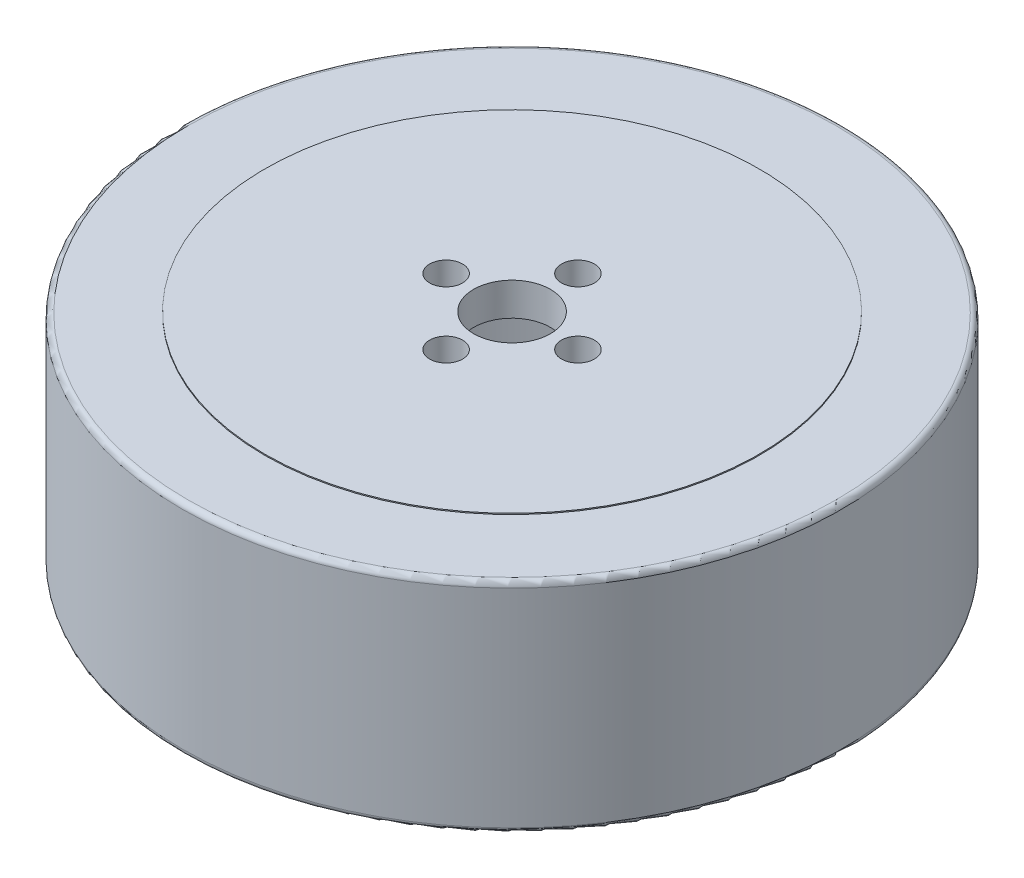
ISO-10303-21;
HEADER;
FILE_DESCRIPTION(('STEP AP214'),'2;1');
FILE_NAME('part.step','',(''),(''),'','','');
FILE_SCHEMA(('AUTOMOTIVE_DESIGN { 1 0 10303 214 1 1 1 1 }'));
ENDSEC;
DATA;
#1=APPLICATION_CONTEXT('core data for automotive mechanical design processes');
#2=APPLICATION_PROTOCOL_DEFINITION('international standard','automotive_design',2000,#1);
#3=PRODUCT_CONTEXT('',#1,'mechanical');
#4=PRODUCT('Part','Part','',(#3));
#5=PRODUCT_RELATED_PRODUCT_CATEGORY('part','',(#4));
#6=PRODUCT_DEFINITION_FORMATION('','',#4);
#7=PRODUCT_DEFINITION_CONTEXT('part definition',#1,'design');
#8=PRODUCT_DEFINITION('design','',#6,#7);
#9=PRODUCT_DEFINITION_SHAPE('','',#8);
#10=(LENGTH_UNIT() NAMED_UNIT(*) SI_UNIT(.MILLI.,.METRE.));
#11=(NAMED_UNIT(*) PLANE_ANGLE_UNIT() SI_UNIT($,.RADIAN.));
#12=(NAMED_UNIT(*) SI_UNIT($,.STERADIAN.) SOLID_ANGLE_UNIT());
#13=UNCERTAINTY_MEASURE_WITH_UNIT(LENGTH_MEASURE(1.E-05),#10,'distance_accuracy_value','');
#14=(GEOMETRIC_REPRESENTATION_CONTEXT(3) GLOBAL_UNCERTAINTY_ASSIGNED_CONTEXT((#13)) GLOBAL_UNIT_ASSIGNED_CONTEXT((#10,
#11,#12)) REPRESENTATION_CONTEXT('',''));
#15=CARTESIAN_POINT('',(0.,0.,0.));
#16=DIRECTION('',(0.,0.,1.));
#17=DIRECTION('',(1.,0.,0.));
#18=AXIS2_PLACEMENT_3D('',#15,#16,#17);
#19=CARTESIAN_POINT('',(0.,20.,0.));
#20=DIRECTION('',(0.,1.,0.));
#21=DIRECTION('',(0.,0.,1.));
#22=AXIS2_PLACEMENT_3D('',#19,#20,#21);
#23=PLANE('',#22);
#24=CARTESIAN_POINT('',(-6.,20.,0.));
#25=DIRECTION('',(0.,1.,0.));
#26=DIRECTION('',(0.,0.,1.));
#27=AXIS2_PLACEMENT_3D('',#24,#25,#26);
#28=CIRCLE('',#27,1.5);
#29=CARTESIAN_POINT('',(-6.,20.,1.49999999999994));
#30=VERTEX_POINT('',#29);
#31=EDGE_CURVE('E74',#30,#30,#28,.T.);
#32=ORIENTED_EDGE('',*,*,#31,.F.);
#33=EDGE_LOOP('',(#32));
#34=FACE_BOUND('',#33,.T.);
#35=CARTESIAN_POINT('',(6.,20.,0.));
#36=DIRECTION('',(0.,1.,0.));
#37=DIRECTION('',(0.,0.,1.));
#38=AXIS2_PLACEMENT_3D('',#35,#36,#37);
#39=CIRCLE('',#38,1.5);
#40=CARTESIAN_POINT('',(6.,20.,1.50000000000002));
#41=VERTEX_POINT('',#40);
#42=EDGE_CURVE('E68',#41,#41,#39,.T.);
#43=ORIENTED_EDGE('',*,*,#42,.F.);
#44=EDGE_LOOP('',(#43));
#45=FACE_BOUND('',#44,.T.);
#46=CARTESIAN_POINT('',(0.,20.,-6.));
#47=DIRECTION('',(0.,1.,0.));
#48=DIRECTION('',(0.,0.,1.));
#49=AXIS2_PLACEMENT_3D('',#46,#47,#48);
#50=CIRCLE('',#49,1.5);
#51=CARTESIAN_POINT('',(0.,20.,-4.5));
#52=VERTEX_POINT('',#51);
#53=EDGE_CURVE('E57',#52,#52,#50,.T.);
#54=ORIENTED_EDGE('',*,*,#53,.F.);
#55=EDGE_LOOP('',(#54));
#56=FACE_BOUND('',#55,.T.);
#57=CARTESIAN_POINT('',(0.,20.,0.));
#58=DIRECTION('',(0.,1.,0.));
#59=DIRECTION('',(0.,0.,1.));
#60=AXIS2_PLACEMENT_3D('',#57,#58,#59);
#61=CIRCLE('',#60,3.5);
#62=CARTESIAN_POINT('',(0.,20.,3.5));
#63=VERTEX_POINT('',#62);
#64=EDGE_CURVE('E65',#63,#63,#61,.T.);
#65=ORIENTED_EDGE('',*,*,#64,.F.);
#66=EDGE_LOOP('',(#65));
#67=FACE_BOUND('',#66,.T.);
#68=CARTESIAN_POINT('',(0.,20.,6.));
#69=DIRECTION('',(0.,1.,0.));
#70=DIRECTION('',(0.,0.,1.));
#71=AXIS2_PLACEMENT_3D('',#68,#69,#70);
#72=CIRCLE('',#71,1.5);
#73=CARTESIAN_POINT('',(0.,20.,7.5));
#74=VERTEX_POINT('',#73);
#75=EDGE_CURVE('E71',#74,#74,#72,.T.);
#76=ORIENTED_EDGE('',*,*,#75,.F.);
#77=EDGE_LOOP('',(#76));
#78=FACE_BOUND('',#77,.T.);
#79=CARTESIAN_POINT('',(0.,20.,0.));
#80=DIRECTION('',(0.,1.,0.));
#81=DIRECTION('',(0.,0.,1.));
#82=AXIS2_PLACEMENT_3D('',#79,#80,#81);
#83=CIRCLE('',#82,22.5);
#84=CARTESIAN_POINT('',(0.,20.,22.5));
#85=VERTEX_POINT('',#84);
#86=EDGE_CURVE('E94',#85,#85,#83,.T.);
#87=ORIENTED_EDGE('',*,*,#86,.T.);
#88=EDGE_LOOP('',(#87));
#89=FACE_BOUND('',#88,.T.);
#90=ADVANCED_FACE('F37',(#34,#45,#56,#67,#78,#89),#23,.T.);
#91=CARTESIAN_POINT('',(0.,20.,0.));
#92=DIRECTION('',(0.,-1.,0.));
#93=DIRECTION('',(0.,0.,-1.));
#94=AXIS2_PLACEMENT_3D('',#91,#92,#93);
#95=CYLINDRICAL_SURFACE('',#94,30.);
#96=CARTESIAN_POINT('',(0.,19.4,0.));
#97=DIRECTION('',(0.,1.,0.));
#98=DIRECTION('',(0.,0.,1.));
#99=AXIS2_PLACEMENT_3D('',#96,#97,#98);
#100=CIRCLE('',#99,30.);
#101=CARTESIAN_POINT('',(0.,19.4,30.));
#102=VERTEX_POINT('',#101);
#103=EDGE_CURVE('E44',#102,#102,#100,.F.);
#104=ORIENTED_EDGE('',*,*,#103,.T.);
#105=EDGE_LOOP('',(#104));
#106=FACE_BOUND('',#105,.T.);
#107=CARTESIAN_POINT('',(0.,0.5,0.));
#108=DIRECTION('',(0.,1.,0.));
#109=DIRECTION('',(0.,0.,1.));
#110=AXIS2_PLACEMENT_3D('',#107,#108,#109);
#111=CIRCLE('',#110,30.);
#112=CARTESIAN_POINT('',(0.,0.5,30.));
#113=VERTEX_POINT('',#112);
#114=EDGE_CURVE('E48',#113,#113,#111,.T.);
#115=ORIENTED_EDGE('',*,*,#114,.T.);
#116=EDGE_LOOP('',(#115));
#117=FACE_BOUND('',#116,.T.);
#118=ADVANCED_FACE('F118',(#106,#117),#95,.T.);
#119=CARTESIAN_POINT('',(0.,20.,-6.));
#120=DIRECTION('',(0.,-1.,0.));
#121=DIRECTION('',(0.,0.,-1.));
#122=AXIS2_PLACEMENT_3D('',#119,#120,#121);
#123=CYLINDRICAL_SURFACE('',#122,1.5);
#124=ORIENTED_EDGE('',*,*,#53,.T.);
#125=EDGE_LOOP('',(#124));
#126=FACE_BOUND('',#125,.T.);
#127=CARTESIAN_POINT('',(0.,17.,-6.));
#128=DIRECTION('',(0.,-1.,0.));
#129=DIRECTION('',(0.,0.,-1.));
#130=AXIS2_PLACEMENT_3D('',#127,#128,#129);
#131=CIRCLE('',#130,1.5);
#132=CARTESIAN_POINT('',(0.,17.,-7.5));
#133=VERTEX_POINT('',#132);
#134=EDGE_CURVE('E77',#133,#133,#131,.T.);
#135=ORIENTED_EDGE('',*,*,#134,.T.);
#136=EDGE_LOOP('',(#135));
#137=FACE_BOUND('',#136,.T.);
#138=ADVANCED_FACE('F124',(#126,#137),#123,.F.);
#139=CARTESIAN_POINT('',(0.,20.,0.));
#140=DIRECTION('',(0.,-1.,0.));
#141=DIRECTION('',(0.,0.,-1.));
#142=AXIS2_PLACEMENT_3D('',#139,#140,#141);
#143=CYLINDRICAL_SURFACE('',#142,3.5);
#144=ORIENTED_EDGE('',*,*,#64,.T.);
#145=EDGE_LOOP('',(#144));
#146=FACE_BOUND('',#145,.T.);
#147=CARTESIAN_POINT('',(0.,17.,0.));
#148=DIRECTION('',(0.,-1.,0.));
#149=DIRECTION('',(0.,0.,-1.));
#150=AXIS2_PLACEMENT_3D('',#147,#148,#149);
#151=CIRCLE('',#150,3.5);
#152=CARTESIAN_POINT('',(0.,17.,-3.5));
#153=VERTEX_POINT('',#152);
#154=EDGE_CURVE('E80',#153,#153,#151,.T.);
#155=ORIENTED_EDGE('',*,*,#154,.T.);
#156=EDGE_LOOP('',(#155));
#157=FACE_BOUND('',#156,.T.);
#158=ADVANCED_FACE('F216',(#146,#157),#143,.F.);
#159=CARTESIAN_POINT('',(6.,20.,0.));
#160=DIRECTION('',(0.,-1.,0.));
#161=DIRECTION('',(0.,0.,-1.));
#162=AXIS2_PLACEMENT_3D('',#159,#160,#161);
#163=CYLINDRICAL_SURFACE('',#162,1.5);
#164=ORIENTED_EDGE('',*,*,#42,.T.);
#165=EDGE_LOOP('',(#164));
#166=FACE_BOUND('',#165,.T.);
#167=CARTESIAN_POINT('',(6.,17.,0.));
#168=DIRECTION('',(0.,-1.,0.));
#169=DIRECTION('',(0.,0.,-1.));
#170=AXIS2_PLACEMENT_3D('',#167,#168,#169);
#171=CIRCLE('',#170,1.5);
#172=CARTESIAN_POINT('',(6.,17.,-1.49999999999998));
#173=VERTEX_POINT('',#172);
#174=EDGE_CURVE('E83',#173,#173,#171,.T.);
#175=ORIENTED_EDGE('',*,*,#174,.T.);
#176=EDGE_LOOP('',(#175));
#177=FACE_BOUND('',#176,.T.);
#178=ADVANCED_FACE('F206',(#166,#177),#163,.F.);
#179=CARTESIAN_POINT('',(0.,20.,6.));
#180=DIRECTION('',(0.,-1.,0.));
#181=DIRECTION('',(0.,0.,-1.));
#182=AXIS2_PLACEMENT_3D('',#179,#180,#181);
#183=CYLINDRICAL_SURFACE('',#182,1.5);
#184=ORIENTED_EDGE('',*,*,#75,.T.);
#185=EDGE_LOOP('',(#184));
#186=FACE_BOUND('',#185,.T.);
#187=CARTESIAN_POINT('',(0.,17.,6.));
#188=DIRECTION('',(0.,-1.,0.));
#189=DIRECTION('',(0.,0.,-1.));
#190=AXIS2_PLACEMENT_3D('',#187,#188,#189);
#191=CIRCLE('',#190,1.5);
#192=CARTESIAN_POINT('',(0.,17.,4.5));
#193=VERTEX_POINT('',#192);
#194=EDGE_CURVE('E61',#193,#193,#191,.T.);
#195=ORIENTED_EDGE('',*,*,#194,.T.);
#196=EDGE_LOOP('',(#195));
#197=FACE_BOUND('',#196,.T.);
#198=ADVANCED_FACE('F196',(#186,#197),#183,.F.);
#199=CARTESIAN_POINT('',(-6.,20.,0.));
#200=DIRECTION('',(0.,-1.,0.));
#201=DIRECTION('',(0.,0.,-1.));
#202=AXIS2_PLACEMENT_3D('',#199,#200,#201);
#203=CYLINDRICAL_SURFACE('',#202,1.5);
#204=ORIENTED_EDGE('',*,*,#31,.T.);
#205=EDGE_LOOP('',(#204));
#206=FACE_BOUND('',#205,.T.);
#207=CARTESIAN_POINT('',(-6.,17.,0.));
#208=DIRECTION('',(0.,-1.,0.));
#209=DIRECTION('',(0.,0.,-1.));
#210=AXIS2_PLACEMENT_3D('',#207,#208,#209);
#211=CIRCLE('',#210,1.5);
#212=CARTESIAN_POINT('',(-6.,17.,-1.50000000000006));
#213=VERTEX_POINT('',#212);
#214=EDGE_CURVE('E58',#213,#213,#211,.T.);
#215=ORIENTED_EDGE('',*,*,#214,.T.);
#216=EDGE_LOOP('',(#215));
#217=FACE_BOUND('',#216,.T.);
#218=ADVANCED_FACE('F133',(#206,#217),#203,.F.);
#219=CARTESIAN_POINT('',(0.,0.,0.));
#220=DIRECTION('',(0.,1.,0.));
#221=DIRECTION('',(0.,0.,1.));
#222=AXIS2_PLACEMENT_3D('',#219,#220,#221);
#223=PLANE('',#222);
#224=CARTESIAN_POINT('',(0.,0.,0.));
#225=DIRECTION('',(0.,1.,0.));
#226=DIRECTION('',(0.,0.,1.));
#227=AXIS2_PLACEMENT_3D('',#224,#225,#226);
#228=CIRCLE('',#227,29.5);
#229=CARTESIAN_POINT('',(0.,0.,29.5));
#230=VERTEX_POINT('',#229);
#231=EDGE_CURVE('E10',#230,#230,#228,.F.);
#232=ORIENTED_EDGE('',*,*,#231,.T.);
#233=EDGE_LOOP('',(#232));
#234=FACE_BOUND('',#233,.T.);
#235=CARTESIAN_POINT('',(0.,0.,0.));
#236=DIRECTION('',(0.,-1.,0.));
#237=DIRECTION('',(0.,0.,-1.));
#238=AXIS2_PLACEMENT_3D('',#235,#236,#237);
#239=CIRCLE('',#238,21.);
#240=CARTESIAN_POINT('',(0.,0.,-21.));
#241=VERTEX_POINT('',#240);
#242=EDGE_CURVE('E88',#241,#241,#239,.T.);
#243=ORIENTED_EDGE('',*,*,#242,.F.);
#244=EDGE_LOOP('',(#243));
#245=FACE_BOUND('',#244,.T.);
#246=ADVANCED_FACE('F131',(#234,#245),#223,.F.);
#247=CARTESIAN_POINT('',(0.,17.,0.));
#248=DIRECTION('',(0.,-1.,0.));
#249=DIRECTION('',(0.,0.,-1.));
#250=AXIS2_PLACEMENT_3D('',#247,#248,#249);
#251=CYLINDRICAL_SURFACE('',#250,21.);
#252=CARTESIAN_POINT('',(0.,17.,0.));
#253=DIRECTION('',(0.,-1.,0.));
#254=DIRECTION('',(0.,0.,-1.));
#255=AXIS2_PLACEMENT_3D('',#252,#253,#254);
#256=CIRCLE('',#255,21.);
#257=CARTESIAN_POINT('',(0.,17.,-21.));
#258=VERTEX_POINT('',#257);
#259=EDGE_CURVE('E62',#258,#258,#256,.T.);
#260=ORIENTED_EDGE('',*,*,#259,.F.);
#261=EDGE_LOOP('',(#260));
#262=FACE_BOUND('',#261,.T.);
#263=ORIENTED_EDGE('',*,*,#242,.T.);
#264=EDGE_LOOP('',(#263));
#265=FACE_BOUND('',#264,.T.);
#266=ADVANCED_FACE('F114',(#262,#265),#251,.F.);
#267=CARTESIAN_POINT('',(0.,17.,0.));
#268=DIRECTION('',(0.,-1.,0.));
#269=DIRECTION('',(0.,0.,-1.));
#270=AXIS2_PLACEMENT_3D('',#267,#268,#269);
#271=PLANE('',#270);
#272=ORIENTED_EDGE('',*,*,#134,.F.);
#273=EDGE_LOOP('',(#272));
#274=FACE_BOUND('',#273,.T.);
#275=ORIENTED_EDGE('',*,*,#154,.F.);
#276=EDGE_LOOP('',(#275));
#277=FACE_BOUND('',#276,.T.);
#278=ORIENTED_EDGE('',*,*,#174,.F.);
#279=EDGE_LOOP('',(#278));
#280=FACE_BOUND('',#279,.T.);
#281=ORIENTED_EDGE('',*,*,#194,.F.);
#282=EDGE_LOOP('',(#281));
#283=FACE_BOUND('',#282,.T.);
#284=ORIENTED_EDGE('',*,*,#214,.F.);
#285=EDGE_LOOP('',(#284));
#286=FACE_BOUND('',#285,.T.);
#287=ORIENTED_EDGE('',*,*,#259,.T.);
#288=EDGE_LOOP('',(#287));
#289=FACE_BOUND('',#288,.T.);
#290=ADVANCED_FACE('F105',(#274,#277,#280,#283,#286,#289),#271,.T.);
#291=CARTESIAN_POINT('',(0.,19.9,0.));
#292=DIRECTION('',(0.,1.,0.));
#293=DIRECTION('',(0.,0.,1.));
#294=AXIS2_PLACEMENT_3D('',#291,#292,#293);
#295=PLANE('',#294);
#296=CARTESIAN_POINT('',(0.,19.9,0.));
#297=DIRECTION('',(0.,1.,0.));
#298=DIRECTION('',(0.,0.,1.));
#299=AXIS2_PLACEMENT_3D('',#296,#297,#298);
#300=CIRCLE('',#299,29.5);
#301=CARTESIAN_POINT('',(0.,19.9,29.5));
#302=VERTEX_POINT('',#301);
#303=EDGE_CURVE('E52',#302,#302,#300,.T.);
#304=ORIENTED_EDGE('',*,*,#303,.T.);
#305=EDGE_LOOP('',(#304));
#306=FACE_BOUND('',#305,.T.);
#307=CARTESIAN_POINT('',(0.,19.9,0.));
#308=DIRECTION('',(0.,1.,0.));
#309=DIRECTION('',(0.,0.,1.));
#310=AXIS2_PLACEMENT_3D('',#307,#308,#309);
#311=CIRCLE('',#310,22.5);
#312=CARTESIAN_POINT('',(0.,19.9,22.5));
#313=VERTEX_POINT('',#312);
#314=EDGE_CURVE('E91',#313,#313,#311,.T.);
#315=ORIENTED_EDGE('',*,*,#314,.F.);
#316=EDGE_LOOP('',(#315));
#317=FACE_BOUND('',#316,.T.);
#318=ADVANCED_FACE('F103',(#306,#317),#295,.T.);
#319=CARTESIAN_POINT('',(0.,19.9,0.));
#320=DIRECTION('',(0.,1.,0.));
#321=DIRECTION('',(0.,0.,1.));
#322=AXIS2_PLACEMENT_3D('',#319,#320,#321);
#323=CYLINDRICAL_SURFACE('',#322,22.5);
#324=ORIENTED_EDGE('',*,*,#314,.T.);
#325=EDGE_LOOP('',(#324));
#326=FACE_BOUND('',#325,.T.);
#327=ORIENTED_EDGE('',*,*,#86,.F.);
#328=EDGE_LOOP('',(#327));
#329=FACE_BOUND('',#328,.T.);
#330=ADVANCED_FACE('F100',(#326,#329),#323,.T.);
#331=CARTESIAN_POINT('',(0.,19.4,0.));
#332=DIRECTION('',(0.,1.,0.));
#333=DIRECTION('',(0.,0.,1.));
#334=AXIS2_PLACEMENT_3D('',#331,#332,#333);
#335=TOROIDAL_SURFACE('',#334,29.5,0.5);
#336=ORIENTED_EDGE('',*,*,#103,.F.);
#337=EDGE_LOOP('',(#336));
#338=FACE_BOUND('',#337,.T.);
#339=ORIENTED_EDGE('',*,*,#303,.F.);
#340=EDGE_LOOP('',(#339));
#341=FACE_BOUND('',#340,.T.);
#342=ADVANCED_FACE('F112',(#338,#341),#335,.T.);
#343=CARTESIAN_POINT('',(0.,0.5,0.));
#344=DIRECTION('',(0.,1.,0.));
#345=DIRECTION('',(0.,0.,1.));
#346=AXIS2_PLACEMENT_3D('',#343,#344,#345);
#347=TOROIDAL_SURFACE('',#346,29.5,0.5);
#348=ORIENTED_EDGE('',*,*,#231,.F.);
#349=EDGE_LOOP('',(#348));
#350=FACE_BOUND('',#349,.T.);
#351=ORIENTED_EDGE('',*,*,#114,.F.);
#352=EDGE_LOOP('',(#351));
#353=FACE_BOUND('',#352,.T.);
#354=ADVANCED_FACE('F39',(#350,#353),#347,.T.);
#355=CLOSED_SHELL('',(#90,#118,#138,#158,#178,#198,#218,#246,#266,#290,#318,#330,#342,#354));
#356=MANIFOLD_SOLID_BREP('B2',#355);
#357=ADVANCED_BREP_SHAPE_REPRESENTATION('',(#18,#356),#14);
#358=SHAPE_DEFINITION_REPRESENTATION(#9,#357);
ENDSEC;
END-ISO-10303-21;
